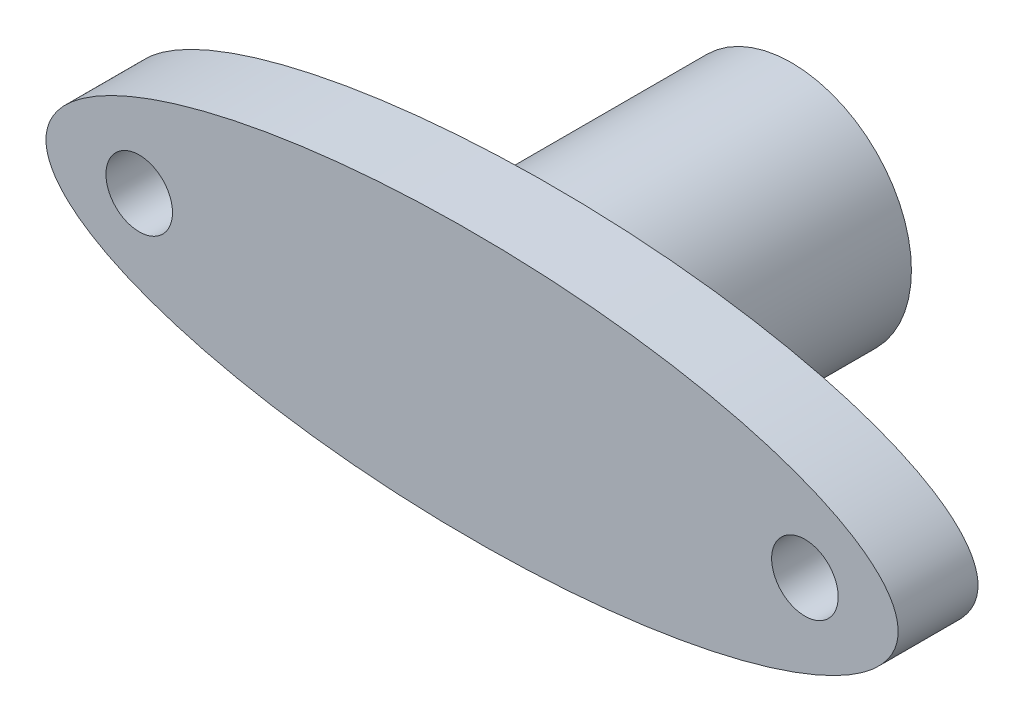
ISO-10303-21;
HEADER;
FILE_DESCRIPTION(('STEP AP214'),'2;1');
FILE_NAME('part.step','',(''),(''),'','','');
FILE_SCHEMA(('AUTOMOTIVE_DESIGN { 1 0 10303 214 1 1 1 1 }'));
ENDSEC;
DATA;
#1=APPLICATION_CONTEXT('core data for automotive mechanical design processes');
#2=APPLICATION_PROTOCOL_DEFINITION('international standard','automotive_design',2000,#1);
#3=PRODUCT_CONTEXT('',#1,'mechanical');
#4=PRODUCT('Part','Part','',(#3));
#5=PRODUCT_RELATED_PRODUCT_CATEGORY('part','',(#4));
#6=PRODUCT_DEFINITION_FORMATION('','',#4);
#7=PRODUCT_DEFINITION_CONTEXT('part definition',#1,'design');
#8=PRODUCT_DEFINITION('design','',#6,#7);
#9=PRODUCT_DEFINITION_SHAPE('','',#8);
#10=(LENGTH_UNIT() NAMED_UNIT(*) SI_UNIT(.MILLI.,.METRE.));
#11=(NAMED_UNIT(*) PLANE_ANGLE_UNIT() SI_UNIT($,.RADIAN.));
#12=(NAMED_UNIT(*) SI_UNIT($,.STERADIAN.) SOLID_ANGLE_UNIT());
#13=UNCERTAINTY_MEASURE_WITH_UNIT(LENGTH_MEASURE(1.E-05),#10,'distance_accuracy_value','');
#14=(GEOMETRIC_REPRESENTATION_CONTEXT(3) GLOBAL_UNCERTAINTY_ASSIGNED_CONTEXT((#13)) GLOBAL_UNIT_ASSIGNED_CONTEXT((#10,
#11,#12)) REPRESENTATION_CONTEXT('',''));
#15=CARTESIAN_POINT('',(0.,0.,0.));
#16=DIRECTION('',(0.,0.,1.));
#17=DIRECTION('',(1.,0.,0.));
#18=AXIS2_PLACEMENT_3D('',#15,#16,#17);
#19=CARTESIAN_POINT('',(0.108253175473055,-0.0624999999999999,-0.45));
#20=DIRECTION('',(0.866025403784439,-0.499999999999999,0.));
#21=DIRECTION('',(0.5,0.866025403784439,0.));
#22=AXIS2_PLACEMENT_3D('',#19,#20,#21);
#23=PLANE('',#22);
#24=DIRECTION('',(-0.5,-0.866025403784439,0.));
#25=VECTOR('',#24,1.);
#26=CARTESIAN_POINT('',(0.108253175473055,-0.0624999999999999,-0.15));
#27=LINE('',#26,#25);
#28=CARTESIAN_POINT('',(0.144337567297406,0.,-0.15));
#29=VERTEX_POINT('',#28);
#30=CARTESIAN_POINT('',(0.0721687836487032,-0.125,-0.15));
#31=VERTEX_POINT('',#30);
#32=EDGE_CURVE('E82',#29,#31,#27,.T.);
#33=ORIENTED_EDGE('',*,*,#32,.F.);
#34=DIRECTION('',(0.,0.,1.));
#35=VECTOR('',#34,1.);
#36=CARTESIAN_POINT('',(0.144337567297406,0.,-0.45));
#37=LINE('',#36,#35);
#38=CARTESIAN_POINT('',(0.144337567297406,0.,-0.45));
#39=VERTEX_POINT('',#38);
#40=EDGE_CURVE('E186',#39,#29,#37,.T.);
#41=ORIENTED_EDGE('',*,*,#40,.F.);
#42=DIRECTION('',(0.5,0.866025403784439,0.));
#43=VECTOR('',#42,1.);
#44=CARTESIAN_POINT('',(0.108253175473055,-0.0624999999999999,-0.45));
#45=LINE('',#44,#43);
#46=CARTESIAN_POINT('',(0.0721687836487032,-0.125,-0.45));
#47=VERTEX_POINT('',#46);
#48=EDGE_CURVE('E161',#47,#39,#45,.T.);
#49=ORIENTED_EDGE('',*,*,#48,.F.);
#50=DIRECTION('',(0.,0.,1.));
#51=VECTOR('',#50,1.);
#52=CARTESIAN_POINT('',(0.0721687836487032,-0.125,-0.45));
#53=LINE('',#52,#51);
#54=EDGE_CURVE('E134',#47,#31,#53,.T.);
#55=ORIENTED_EDGE('',*,*,#54,.T.);
#56=EDGE_LOOP('',(#33,#41,#49,#55));
#57=FACE_BOUND('',#56,.T.);
#58=ADVANCED_FACE('F64',(#57),#23,.F.);
#59=CARTESIAN_POINT('',(0.108253175473055,0.0624999999999999,-0.45));
#60=DIRECTION('',(0.866025403784439,0.5,0.));
#61=DIRECTION('',(-0.5,0.866025403784439,0.));
#62=AXIS2_PLACEMENT_3D('',#59,#60,#61);
#63=PLANE('',#62);
#64=DIRECTION('',(0.5,-0.866025403784439,0.));
#65=VECTOR('',#64,1.);
#66=CARTESIAN_POINT('',(0.108253175473055,0.0624999999999999,-0.15));
#67=LINE('',#66,#65);
#68=CARTESIAN_POINT('',(0.0721687836487031,0.125,-0.15));
#69=VERTEX_POINT('',#68);
#70=EDGE_CURVE('E89',#69,#29,#67,.T.);
#71=ORIENTED_EDGE('',*,*,#70,.F.);
#72=DIRECTION('',(0.,0.,1.));
#73=VECTOR('',#72,1.);
#74=CARTESIAN_POINT('',(0.0721687836487031,0.125,-0.45));
#75=LINE('',#74,#73);
#76=CARTESIAN_POINT('',(0.0721687836487031,0.125,-0.45));
#77=VERTEX_POINT('',#76);
#78=EDGE_CURVE('E190',#77,#69,#75,.T.);
#79=ORIENTED_EDGE('',*,*,#78,.F.);
#80=DIRECTION('',(-0.5,0.866025403784439,0.));
#81=VECTOR('',#80,1.);
#82=CARTESIAN_POINT('',(0.108253175473055,0.0624999999999999,-0.45));
#83=LINE('',#82,#81);
#84=EDGE_CURVE('E176',#39,#77,#83,.T.);
#85=ORIENTED_EDGE('',*,*,#84,.F.);
#86=ORIENTED_EDGE('',*,*,#40,.T.);
#87=EDGE_LOOP('',(#71,#79,#85,#86));
#88=FACE_BOUND('',#87,.T.);
#89=ADVANCED_FACE('F228',(#88),#63,.F.);
#90=CARTESIAN_POINT('',(0.,0.125,-0.45));
#91=DIRECTION('',(0.,1.,0.));
#92=DIRECTION('',(0.,0.,1.));
#93=AXIS2_PLACEMENT_3D('',#90,#91,#92);
#94=PLANE('',#93);
#95=DIRECTION('',(1.,0.,0.));
#96=VECTOR('',#95,1.);
#97=CARTESIAN_POINT('',(0.,0.125,-0.15));
#98=LINE('',#97,#96);
#99=CARTESIAN_POINT('',(-0.0721687836487032,0.125,-0.15));
#100=VERTEX_POINT('',#99);
#101=EDGE_CURVE('E152',#100,#69,#98,.T.);
#102=ORIENTED_EDGE('',*,*,#101,.F.);
#103=DIRECTION('',(0.,0.,1.));
#104=VECTOR('',#103,1.);
#105=CARTESIAN_POINT('',(-0.0721687836487032,0.125,-0.45));
#106=LINE('',#105,#104);
#107=CARTESIAN_POINT('',(-0.0721687836487032,0.125,-0.45));
#108=VERTEX_POINT('',#107);
#109=EDGE_CURVE('E193',#108,#100,#106,.T.);
#110=ORIENTED_EDGE('',*,*,#109,.F.);
#111=DIRECTION('',(-1.,0.,0.));
#112=VECTOR('',#111,1.);
#113=CARTESIAN_POINT('',(0.,0.125,-0.45));
#114=LINE('',#113,#112);
#115=EDGE_CURVE('E173',#77,#108,#114,.T.);
#116=ORIENTED_EDGE('',*,*,#115,.F.);
#117=ORIENTED_EDGE('',*,*,#78,.T.);
#118=EDGE_LOOP('',(#102,#110,#116,#117));
#119=FACE_BOUND('',#118,.T.);
#120=ADVANCED_FACE('F233',(#119),#94,.F.);
#121=CARTESIAN_POINT('',(-0.108253175473055,0.0625,-0.45));
#122=DIRECTION('',(-0.866025403784439,0.5,0.));
#123=DIRECTION('',(-0.5,-0.866025403784439,0.));
#124=AXIS2_PLACEMENT_3D('',#121,#122,#123);
#125=PLANE('',#124);
#126=DIRECTION('',(0.5,0.866025403784439,0.));
#127=VECTOR('',#126,1.);
#128=CARTESIAN_POINT('',(-0.108253175473055,0.0625,-0.15));
#129=LINE('',#128,#127);
#130=CARTESIAN_POINT('',(-0.144337567297406,0.,-0.15));
#131=VERTEX_POINT('',#130);
#132=EDGE_CURVE('E144',#131,#100,#129,.T.);
#133=ORIENTED_EDGE('',*,*,#132,.F.);
#134=DIRECTION('',(0.,0.,1.));
#135=VECTOR('',#134,1.);
#136=CARTESIAN_POINT('',(-0.144337567297406,0.,-0.45));
#137=LINE('',#136,#135);
#138=CARTESIAN_POINT('',(-0.144337567297406,0.,-0.45));
#139=VERTEX_POINT('',#138);
#140=EDGE_CURVE('E133',#139,#131,#137,.T.);
#141=ORIENTED_EDGE('',*,*,#140,.F.);
#142=DIRECTION('',(-0.5,-0.866025403784439,0.));
#143=VECTOR('',#142,1.);
#144=CARTESIAN_POINT('',(-0.108253175473055,0.0625,-0.45));
#145=LINE('',#144,#143);
#146=EDGE_CURVE('E170',#108,#139,#145,.T.);
#147=ORIENTED_EDGE('',*,*,#146,.F.);
#148=ORIENTED_EDGE('',*,*,#109,.T.);
#149=EDGE_LOOP('',(#133,#141,#147,#148));
#150=FACE_BOUND('',#149,.T.);
#151=ADVANCED_FACE('F283',(#150),#125,.F.);
#152=CARTESIAN_POINT('',(-0.108253175473055,-0.0625,-0.45));
#153=DIRECTION('',(-0.866025403784439,-0.5,0.));
#154=DIRECTION('',(0.5,-0.866025403784439,0.));
#155=AXIS2_PLACEMENT_3D('',#152,#153,#154);
#156=PLANE('',#155);
#157=DIRECTION('',(-0.5,0.866025403784439,0.));
#158=VECTOR('',#157,1.);
#159=CARTESIAN_POINT('',(-0.108253175473055,-0.0625,-0.15));
#160=LINE('',#159,#158);
#161=CARTESIAN_POINT('',(-0.0721687836487032,-0.125,-0.15));
#162=VERTEX_POINT('',#161);
#163=EDGE_CURVE('E138',#162,#131,#160,.T.);
#164=ORIENTED_EDGE('',*,*,#163,.F.);
#165=DIRECTION('',(0.,0.,1.));
#166=VECTOR('',#165,1.);
#167=CARTESIAN_POINT('',(-0.0721687836487032,-0.125,-0.45));
#168=LINE('',#167,#166);
#169=CARTESIAN_POINT('',(-0.0721687836487032,-0.125,-0.45));
#170=VERTEX_POINT('',#169);
#171=EDGE_CURVE('E123',#170,#162,#168,.T.);
#172=ORIENTED_EDGE('',*,*,#171,.F.);
#173=DIRECTION('',(0.5,-0.866025403784439,0.));
#174=VECTOR('',#173,1.);
#175=CARTESIAN_POINT('',(-0.108253175473055,-0.0625,-0.45));
#176=LINE('',#175,#174);
#177=EDGE_CURVE('E167',#139,#170,#176,.T.);
#178=ORIENTED_EDGE('',*,*,#177,.F.);
#179=ORIENTED_EDGE('',*,*,#140,.T.);
#180=EDGE_LOOP('',(#164,#172,#178,#179));
#181=FACE_BOUND('',#180,.T.);
#182=ADVANCED_FACE('F139',(#181),#156,.F.);
#183=CARTESIAN_POINT('',(0.,-0.125,-0.45));
#184=DIRECTION('',(0.,-1.,0.));
#185=DIRECTION('',(1.,0.,0.));
#186=AXIS2_PLACEMENT_3D('',#183,#184,#185);
#187=PLANE('',#186);
#188=DIRECTION('',(-1.,0.,0.));
#189=VECTOR('',#188,1.);
#190=CARTESIAN_POINT('',(0.,-0.125,-0.15));
#191=LINE('',#190,#189);
#192=EDGE_CURVE('E128',#31,#162,#191,.T.);
#193=ORIENTED_EDGE('',*,*,#192,.F.);
#194=ORIENTED_EDGE('',*,*,#54,.F.);
#195=DIRECTION('',(1.,0.,0.));
#196=VECTOR('',#195,1.);
#197=CARTESIAN_POINT('',(0.,-0.125,-0.45));
#198=LINE('',#197,#196);
#199=EDGE_CURVE('E129',#170,#47,#198,.T.);
#200=ORIENTED_EDGE('',*,*,#199,.F.);
#201=ORIENTED_EDGE('',*,*,#171,.T.);
#202=EDGE_LOOP('',(#193,#194,#200,#201));
#203=FACE_BOUND('',#202,.T.);
#204=ADVANCED_FACE('F125',(#203),#187,.F.);
#205=CARTESIAN_POINT('',(-0.625,0.,0.15));
#206=DIRECTION('',(0.,0.,-1.));
#207=DIRECTION('',(-1.,0.,0.));
#208=AXIS2_PLACEMENT_3D('',#205,#206,#207);
#209=CYLINDRICAL_SURFACE('',#208,0.0625);
#210=CARTESIAN_POINT('',(-0.625,0.,0.15));
#211=DIRECTION('',(0.,0.,1.));
#212=DIRECTION('',(1.,0.,0.));
#213=AXIS2_PLACEMENT_3D('',#210,#211,#212);
#214=CIRCLE('',#213,0.0625);
#215=CARTESIAN_POINT('',(-0.5625,0.,0.15));
#216=VERTEX_POINT('',#215);
#217=EDGE_CURVE('E74',#216,#216,#214,.T.);
#218=ORIENTED_EDGE('',*,*,#217,.T.);
#219=EDGE_LOOP('',(#218));
#220=FACE_BOUND('',#219,.T.);
#221=CARTESIAN_POINT('',(-0.625,0.,0.));
#222=DIRECTION('',(0.,0.,1.));
#223=DIRECTION('',(1.,0.,0.));
#224=AXIS2_PLACEMENT_3D('',#221,#222,#223);
#225=CIRCLE('',#224,0.0625);
#226=CARTESIAN_POINT('',(-0.5625,0.,0.));
#227=VERTEX_POINT('',#226);
#228=EDGE_CURVE('E253',#227,#227,#225,.T.);
#229=ORIENTED_EDGE('',*,*,#228,.F.);
#230=EDGE_LOOP('',(#229));
#231=FACE_BOUND('',#230,.T.);
#232=ADVANCED_FACE('F217',(#220,#231),#209,.F.);
#233=CARTESIAN_POINT('',(0.625,0.,0.15));
#234=DIRECTION('',(0.,0.,-1.));
#235=DIRECTION('',(-1.,0.,0.));
#236=AXIS2_PLACEMENT_3D('',#233,#234,#235);
#237=CYLINDRICAL_SURFACE('',#236,0.0625);
#238=CARTESIAN_POINT('',(0.625,0.,0.15));
#239=DIRECTION('',(0.,0.,1.));
#240=DIRECTION('',(1.,0.,0.));
#241=AXIS2_PLACEMENT_3D('',#238,#239,#240);
#242=CIRCLE('',#241,0.0625);
#243=CARTESIAN_POINT('',(0.6875,0.,0.15));
#244=VERTEX_POINT('',#243);
#245=EDGE_CURVE('E201',#244,#244,#242,.T.);
#246=ORIENTED_EDGE('',*,*,#245,.T.);
#247=EDGE_LOOP('',(#246));
#248=FACE_BOUND('',#247,.T.);
#249=CARTESIAN_POINT('',(0.625,0.,0.));
#250=DIRECTION('',(0.,0.,1.));
#251=DIRECTION('',(1.,0.,0.));
#252=AXIS2_PLACEMENT_3D('',#249,#250,#251);
#253=CIRCLE('',#252,0.0625);
#254=CARTESIAN_POINT('',(0.6875,0.,0.));
#255=VERTEX_POINT('',#254);
#256=EDGE_CURVE('E189',#255,#255,#253,.T.);
#257=ORIENTED_EDGE('',*,*,#256,.F.);
#258=EDGE_LOOP('',(#257));
#259=FACE_BOUND('',#258,.T.);
#260=ADVANCED_FACE('F66',(#248,#259),#237,.F.);
#261=CARTESIAN_POINT('',(0.,0.,0.15));
#262=DIRECTION('',(0.,0.,1.));
#263=DIRECTION('',(-1.,0.,0.));
#264=AXIS2_PLACEMENT_3D('',#261,#262,#263);
#265=ELLIPSE('',#264,0.8,0.25);
#266=DIRECTION('',(0.,0.,-1.));
#267=VECTOR('',#266,1.);
#268=SURFACE_OF_LINEAR_EXTRUSION('',#265,#267);
#269=CARTESIAN_POINT('',(-0.8,0.,0.15));
#270=VERTEX_POINT('',#269);
#271=EDGE_CURVE('E12',#270,#270,#265,.T.);
#272=ORIENTED_EDGE('',*,*,#271,.F.);
#273=EDGE_LOOP('',(#272));
#274=FACE_BOUND('',#273,.T.);
#275=CARTESIAN_POINT('',(0.,0.,0.));
#276=DIRECTION('',(0.,0.,1.));
#277=DIRECTION('',(-1.,0.,0.));
#278=AXIS2_PLACEMENT_3D('',#275,#276,#277);
#279=ELLIPSE('',#278,0.8,0.25);
#280=CARTESIAN_POINT('',(-0.8,0.,0.));
#281=VERTEX_POINT('',#280);
#282=EDGE_CURVE('E68',#281,#281,#279,.T.);
#283=ORIENTED_EDGE('',*,*,#282,.T.);
#284=EDGE_LOOP('',(#283));
#285=FACE_BOUND('',#284,.T.);
#286=ADVANCED_FACE('F210',(#274,#285),#268,.F.);
#287=CARTESIAN_POINT('',(0.,0.,0.15));
#288=DIRECTION('',(0.,0.,1.));
#289=DIRECTION('',(1.,0.,0.));
#290=AXIS2_PLACEMENT_3D('',#287,#288,#289);
#291=PLANE('',#290);
#292=ORIENTED_EDGE('',*,*,#245,.F.);
#293=EDGE_LOOP('',(#292));
#294=FACE_BOUND('',#293,.T.);
#295=ORIENTED_EDGE('',*,*,#217,.F.);
#296=EDGE_LOOP('',(#295));
#297=FACE_BOUND('',#296,.T.);
#298=ORIENTED_EDGE('',*,*,#271,.T.);
#299=EDGE_LOOP('',(#298));
#300=FACE_BOUND('',#299,.T.);
#301=ADVANCED_FACE('F213',(#294,#297,#300),#291,.T.);
#302=CARTESIAN_POINT('',(0.,0.,0.));
#303=DIRECTION('',(0.,0.,1.));
#304=DIRECTION('',(1.,0.,0.));
#305=AXIS2_PLACEMENT_3D('',#302,#303,#304);
#306=PLANE('',#305);
#307=CARTESIAN_POINT('',(0.,0.,0.));
#308=DIRECTION('',(0.,0.,1.));
#309=DIRECTION('',(1.,0.,0.));
#310=AXIS2_PLACEMENT_3D('',#307,#308,#309);
#311=CIRCLE('',#310,0.225);
#312=CARTESIAN_POINT('',(0.225,0.,0.));
#313=VERTEX_POINT('',#312);
#314=EDGE_CURVE('E160',#313,#313,#311,.T.);
#315=ORIENTED_EDGE('',*,*,#314,.T.);
#316=EDGE_LOOP('',(#315));
#317=FACE_BOUND('',#316,.T.);
#318=ORIENTED_EDGE('',*,*,#256,.T.);
#319=EDGE_LOOP('',(#318));
#320=FACE_BOUND('',#319,.T.);
#321=ORIENTED_EDGE('',*,*,#228,.T.);
#322=EDGE_LOOP('',(#321));
#323=FACE_BOUND('',#322,.T.);
#324=ORIENTED_EDGE('',*,*,#282,.F.);
#325=EDGE_LOOP('',(#324));
#326=FACE_BOUND('',#325,.T.);
#327=ADVANCED_FACE('F215',(#317,#320,#323,#326),#306,.F.);
#328=CARTESIAN_POINT('',(0.,0.,-0.45));
#329=DIRECTION('',(0.,0.,1.));
#330=DIRECTION('',(1.,0.,0.));
#331=AXIS2_PLACEMENT_3D('',#328,#329,#330);
#332=CYLINDRICAL_SURFACE('',#331,0.225);
#333=ORIENTED_EDGE('',*,*,#314,.F.);
#334=EDGE_LOOP('',(#333));
#335=FACE_BOUND('',#334,.T.);
#336=CARTESIAN_POINT('',(0.,0.,-0.45));
#337=DIRECTION('',(0.,0.,1.));
#338=DIRECTION('',(1.,0.,0.));
#339=AXIS2_PLACEMENT_3D('',#336,#337,#338);
#340=CIRCLE('',#339,0.225);
#341=CARTESIAN_POINT('',(0.225,0.,-0.45));
#342=VERTEX_POINT('',#341);
#343=EDGE_CURVE('E179',#342,#342,#340,.T.);
#344=ORIENTED_EDGE('',*,*,#343,.T.);
#345=EDGE_LOOP('',(#344));
#346=FACE_BOUND('',#345,.T.);
#347=ADVANCED_FACE('F241',(#335,#346),#332,.T.);
#348=CARTESIAN_POINT('',(0.,0.,-0.45));
#349=DIRECTION('',(0.,0.,1.));
#350=DIRECTION('',(1.,0.,0.));
#351=AXIS2_PLACEMENT_3D('',#348,#349,#350);
#352=PLANE('',#351);
#353=ORIENTED_EDGE('',*,*,#48,.T.);
#354=ORIENTED_EDGE('',*,*,#84,.T.);
#355=ORIENTED_EDGE('',*,*,#115,.T.);
#356=ORIENTED_EDGE('',*,*,#146,.T.);
#357=ORIENTED_EDGE('',*,*,#177,.T.);
#358=ORIENTED_EDGE('',*,*,#199,.T.);
#359=EDGE_LOOP('',(#353,#354,#355,#356,#357,#358));
#360=FACE_BOUND('',#359,.T.);
#361=ORIENTED_EDGE('',*,*,#343,.F.);
#362=EDGE_LOOP('',(#361));
#363=FACE_BOUND('',#362,.T.);
#364=ADVANCED_FACE('F266',(#360,#363),#352,.F.);
#365=CARTESIAN_POINT('',(0.,0.,-0.15));
#366=DIRECTION('',(0.,0.,1.));
#367=DIRECTION('',(1.,0.,0.));
#368=AXIS2_PLACEMENT_3D('',#365,#366,#367);
#369=PLANE('',#368);
#370=ORIENTED_EDGE('',*,*,#70,.T.);
#371=ORIENTED_EDGE('',*,*,#32,.T.);
#372=ORIENTED_EDGE('',*,*,#192,.T.);
#373=ORIENTED_EDGE('',*,*,#163,.T.);
#374=ORIENTED_EDGE('',*,*,#132,.T.);
#375=ORIENTED_EDGE('',*,*,#101,.T.);
#376=EDGE_LOOP('',(#370,#371,#372,#373,#374,#375));
#377=FACE_BOUND('',#376,.T.);
#378=ADVANCED_FACE('F146',(#377),#369,.F.);
#379=CLOSED_SHELL('',(#58,#89,#120,#151,#182,#204,#232,#260,#286,#301,#327,#347,#364,#378));
#380=MANIFOLD_SOLID_BREP('B2',#379);
#381=ADVANCED_BREP_SHAPE_REPRESENTATION('',(#18,#380),#14);
#382=SHAPE_DEFINITION_REPRESENTATION(#9,#381);
ENDSEC;
END-ISO-10303-21;
